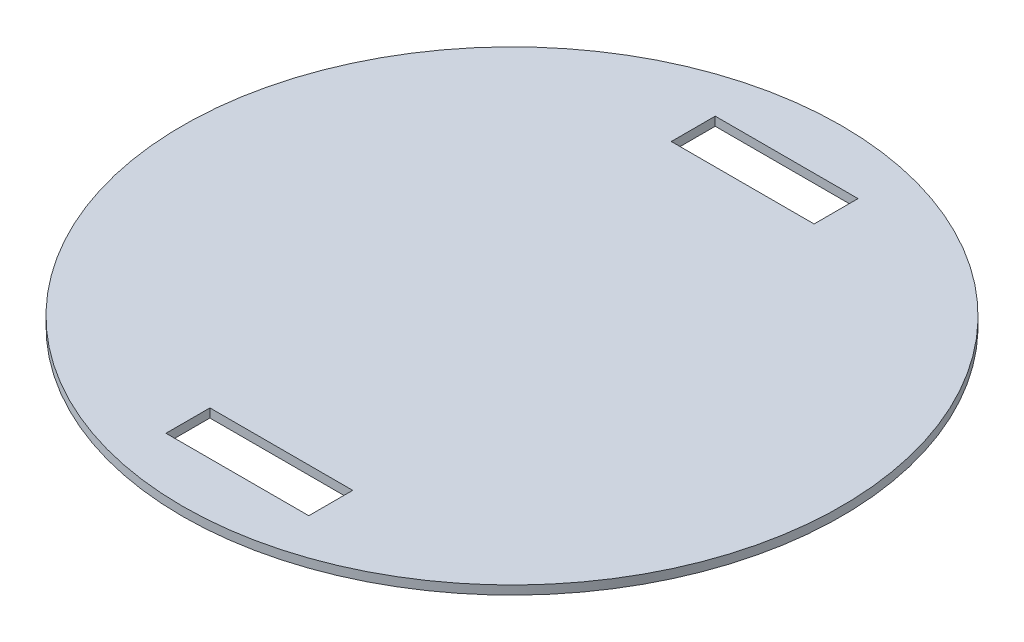
ISO-10303-21;
HEADER;
FILE_DESCRIPTION(('STEP AP214'),'2;1');
FILE_NAME('part.step','',(''),(''),'','','');
FILE_SCHEMA(('AUTOMOTIVE_DESIGN { 1 0 10303 214 1 1 1 1 }'));
ENDSEC;
DATA;
#1=APPLICATION_CONTEXT('core data for automotive mechanical design processes');
#2=APPLICATION_PROTOCOL_DEFINITION('international standard','automotive_design',2000,#1);
#3=PRODUCT_CONTEXT('',#1,'mechanical');
#4=PRODUCT('Part','Part','',(#3));
#5=PRODUCT_RELATED_PRODUCT_CATEGORY('part','',(#4));
#6=PRODUCT_DEFINITION_FORMATION('','',#4);
#7=PRODUCT_DEFINITION_CONTEXT('part definition',#1,'design');
#8=PRODUCT_DEFINITION('design','',#6,#7);
#9=PRODUCT_DEFINITION_SHAPE('','',#8);
#10=(LENGTH_UNIT() NAMED_UNIT(*) SI_UNIT(.MILLI.,.METRE.));
#11=(NAMED_UNIT(*) PLANE_ANGLE_UNIT() SI_UNIT($,.RADIAN.));
#12=(NAMED_UNIT(*) SI_UNIT($,.STERADIAN.) SOLID_ANGLE_UNIT());
#13=UNCERTAINTY_MEASURE_WITH_UNIT(LENGTH_MEASURE(1.E-05),#10,'distance_accuracy_value','');
#14=(GEOMETRIC_REPRESENTATION_CONTEXT(3) GLOBAL_UNCERTAINTY_ASSIGNED_CONTEXT((#13)) GLOBAL_UNIT_ASSIGNED_CONTEXT((#10,
#11,#12)) REPRESENTATION_CONTEXT('',''));
#15=CARTESIAN_POINT('',(0.,0.,0.));
#16=DIRECTION('',(0.,0.,1.));
#17=DIRECTION('',(1.,0.,0.));
#18=AXIS2_PLACEMENT_3D('',#15,#16,#17);
#19=CARTESIAN_POINT('',(0.,-4.,0.));
#20=DIRECTION('',(0.,1.,0.));
#21=DIRECTION('',(0.,0.,1.));
#22=AXIS2_PLACEMENT_3D('',#19,#20,#21);
#23=CYLINDRICAL_SURFACE('',#22,150.);
#24=CARTESIAN_POINT('',(0.,-4.,0.));
#25=DIRECTION('',(0.,1.,0.));
#26=DIRECTION('',(0.,0.,1.));
#27=AXIS2_PLACEMENT_3D('',#24,#25,#26);
#28=CIRCLE('',#27,150.);
#29=CARTESIAN_POINT('',(0.,-4.,150.));
#30=VERTEX_POINT('',#29);
#31=EDGE_CURVE('E11',#30,#30,#28,.T.);
#32=ORIENTED_EDGE('',*,*,#31,.T.);
#33=EDGE_LOOP('',(#32));
#34=FACE_BOUND('',#33,.T.);
#35=CARTESIAN_POINT('',(0.,0.,0.));
#36=DIRECTION('',(0.,1.,0.));
#37=DIRECTION('',(0.,0.,1.));
#38=AXIS2_PLACEMENT_3D('',#35,#36,#37);
#39=CIRCLE('',#38,150.);
#40=CARTESIAN_POINT('',(0.,0.,150.));
#41=VERTEX_POINT('',#40);
#42=EDGE_CURVE('E37',#41,#41,#39,.T.);
#43=ORIENTED_EDGE('',*,*,#42,.F.);
#44=EDGE_LOOP('',(#43));
#45=FACE_BOUND('',#44,.T.);
#46=ADVANCED_FACE('F34',(#34,#45),#23,.T.);
#47=CARTESIAN_POINT('',(0.,-4.,0.));
#48=DIRECTION('',(0.,1.,0.));
#49=DIRECTION('',(0.,0.,1.));
#50=AXIS2_PLACEMENT_3D('',#47,#48,#49);
#51=PLANE('',#50);
#52=DIRECTION('',(-1.,0.,0.));
#53=VECTOR('',#52,1.);
#54=CARTESIAN_POINT('',(-32.5,-4.,105.));
#55=LINE('',#54,#53);
#56=CARTESIAN_POINT('',(32.5,-4.,105.));
#57=VERTEX_POINT('',#56);
#58=CARTESIAN_POINT('',(-32.5,-4.,105.));
#59=VERTEX_POINT('',#58);
#60=EDGE_CURVE('E110',#57,#59,#55,.T.);
#61=ORIENTED_EDGE('',*,*,#60,.T.);
#62=DIRECTION('',(0.,0.,1.));
#63=VECTOR('',#62,1.);
#64=CARTESIAN_POINT('',(-32.5,-4.,125.));
#65=LINE('',#64,#63);
#66=CARTESIAN_POINT('',(-32.5,-4.,125.));
#67=VERTEX_POINT('',#66);
#68=EDGE_CURVE('E102',#59,#67,#65,.T.);
#69=ORIENTED_EDGE('',*,*,#68,.T.);
#70=DIRECTION('',(1.,0.,0.));
#71=VECTOR('',#70,1.);
#72=CARTESIAN_POINT('',(-32.5,-4.,125.));
#73=LINE('',#72,#71);
#74=CARTESIAN_POINT('',(32.5,-4.,125.));
#75=VERTEX_POINT('',#74);
#76=EDGE_CURVE('E113',#67,#75,#73,.T.);
#77=ORIENTED_EDGE('',*,*,#76,.T.);
#78=DIRECTION('',(0.,0.,-1.));
#79=VECTOR('',#78,1.);
#80=CARTESIAN_POINT('',(32.5,-4.,125.));
#81=LINE('',#80,#79);
#82=EDGE_CURVE('E48',#75,#57,#81,.T.);
#83=ORIENTED_EDGE('',*,*,#82,.T.);
#84=EDGE_LOOP('',(#61,#69,#77,#83));
#85=FACE_BOUND('',#84,.T.);
#86=DIRECTION('',(-1.,0.,0.));
#87=VECTOR('',#86,1.);
#88=CARTESIAN_POINT('',(-32.5,-4.,-125.));
#89=LINE('',#88,#87);
#90=CARTESIAN_POINT('',(32.5,-4.,-125.));
#91=VERTEX_POINT('',#90);
#92=CARTESIAN_POINT('',(-32.5,-4.,-125.));
#93=VERTEX_POINT('',#92);
#94=EDGE_CURVE('E147',#91,#93,#89,.T.);
#95=ORIENTED_EDGE('',*,*,#94,.T.);
#96=DIRECTION('',(0.,0.,1.));
#97=VECTOR('',#96,1.);
#98=CARTESIAN_POINT('',(-32.5,-4.,-105.));
#99=LINE('',#98,#97);
#100=CARTESIAN_POINT('',(-32.5,-4.,-105.));
#101=VERTEX_POINT('',#100);
#102=EDGE_CURVE('E139',#93,#101,#99,.T.);
#103=ORIENTED_EDGE('',*,*,#102,.T.);
#104=DIRECTION('',(1.,0.,0.));
#105=VECTOR('',#104,1.);
#106=CARTESIAN_POINT('',(-32.5,-4.,-105.));
#107=LINE('',#106,#105);
#108=CARTESIAN_POINT('',(32.5,-4.,-105.));
#109=VERTEX_POINT('',#108);
#110=EDGE_CURVE('E142',#101,#109,#107,.T.);
#111=ORIENTED_EDGE('',*,*,#110,.T.);
#112=DIRECTION('',(0.,0.,-1.));
#113=VECTOR('',#112,1.);
#114=CARTESIAN_POINT('',(32.5,-4.,-105.));
#115=LINE('',#114,#113);
#116=EDGE_CURVE('E56',#109,#91,#115,.T.);
#117=ORIENTED_EDGE('',*,*,#116,.T.);
#118=EDGE_LOOP('',(#95,#103,#111,#117));
#119=FACE_BOUND('',#118,.T.);
#120=ORIENTED_EDGE('',*,*,#31,.F.);
#121=EDGE_LOOP('',(#120));
#122=FACE_BOUND('',#121,.T.);
#123=ADVANCED_FACE('F117',(#85,#119,#122),#51,.F.);
#124=CARTESIAN_POINT('',(0.,0.,0.));
#125=DIRECTION('',(0.,1.,0.));
#126=DIRECTION('',(0.,0.,1.));
#127=AXIS2_PLACEMENT_3D('',#124,#125,#126);
#128=PLANE('',#127);
#129=DIRECTION('',(0.,0.,1.));
#130=VECTOR('',#129,1.);
#131=CARTESIAN_POINT('',(-32.5,0.,125.));
#132=LINE('',#131,#130);
#133=CARTESIAN_POINT('',(-32.5,0.,105.));
#134=VERTEX_POINT('',#133);
#135=CARTESIAN_POINT('',(-32.5,0.,125.));
#136=VERTEX_POINT('',#135);
#137=EDGE_CURVE('E105',#134,#136,#132,.T.);
#138=ORIENTED_EDGE('',*,*,#137,.F.);
#139=DIRECTION('',(-1.,0.,0.));
#140=VECTOR('',#139,1.);
#141=CARTESIAN_POINT('',(-32.5,0.,105.));
#142=LINE('',#141,#140);
#143=CARTESIAN_POINT('',(32.5,0.,105.));
#144=VERTEX_POINT('',#143);
#145=EDGE_CURVE('E120',#144,#134,#142,.T.);
#146=ORIENTED_EDGE('',*,*,#145,.F.);
#147=DIRECTION('',(0.,0.,-1.));
#148=VECTOR('',#147,1.);
#149=CARTESIAN_POINT('',(32.5,0.,125.));
#150=LINE('',#149,#148);
#151=CARTESIAN_POINT('',(32.5,0.,125.));
#152=VERTEX_POINT('',#151);
#153=EDGE_CURVE('E123',#152,#144,#150,.T.);
#154=ORIENTED_EDGE('',*,*,#153,.F.);
#155=DIRECTION('',(1.,0.,0.));
#156=VECTOR('',#155,1.);
#157=CARTESIAN_POINT('',(-32.5,0.,125.));
#158=LINE('',#157,#156);
#159=EDGE_CURVE('E129',#136,#152,#158,.T.);
#160=ORIENTED_EDGE('',*,*,#159,.F.);
#161=EDGE_LOOP('',(#138,#146,#154,#160));
#162=FACE_BOUND('',#161,.T.);
#163=DIRECTION('',(0.,0.,1.));
#164=VECTOR('',#163,1.);
#165=CARTESIAN_POINT('',(-32.5,0.,-105.));
#166=LINE('',#165,#164);
#167=CARTESIAN_POINT('',(-32.5,0.,-125.));
#168=VERTEX_POINT('',#167);
#169=CARTESIAN_POINT('',(-32.5,0.,-105.));
#170=VERTEX_POINT('',#169);
#171=EDGE_CURVE('E151',#168,#170,#166,.T.);
#172=ORIENTED_EDGE('',*,*,#171,.F.);
#173=DIRECTION('',(-1.,0.,0.));
#174=VECTOR('',#173,1.);
#175=CARTESIAN_POINT('',(-32.5,0.,-125.));
#176=LINE('',#175,#174);
#177=CARTESIAN_POINT('',(32.5,0.,-125.));
#178=VERTEX_POINT('',#177);
#179=EDGE_CURVE('E143',#178,#168,#176,.T.);
#180=ORIENTED_EDGE('',*,*,#179,.F.);
#181=DIRECTION('',(0.,0.,-1.));
#182=VECTOR('',#181,1.);
#183=CARTESIAN_POINT('',(32.5,0.,-105.));
#184=LINE('',#183,#182);
#185=CARTESIAN_POINT('',(32.5,0.,-105.));
#186=VERTEX_POINT('',#185);
#187=EDGE_CURVE('E156',#186,#178,#184,.T.);
#188=ORIENTED_EDGE('',*,*,#187,.F.);
#189=DIRECTION('',(1.,0.,0.));
#190=VECTOR('',#189,1.);
#191=CARTESIAN_POINT('',(-32.5,0.,-105.));
#192=LINE('',#191,#190);
#193=EDGE_CURVE('E153',#170,#186,#192,.T.);
#194=ORIENTED_EDGE('',*,*,#193,.F.);
#195=EDGE_LOOP('',(#172,#180,#188,#194));
#196=FACE_BOUND('',#195,.T.);
#197=ORIENTED_EDGE('',*,*,#42,.T.);
#198=EDGE_LOOP('',(#197));
#199=FACE_BOUND('',#198,.T.);
#200=ADVANCED_FACE('F176',(#162,#196,#199),#128,.T.);
#201=CARTESIAN_POINT('',(-32.5,-4.,-105.));
#202=DIRECTION('',(-1.,0.,0.));
#203=DIRECTION('',(0.,0.,1.));
#204=AXIS2_PLACEMENT_3D('',#201,#202,#203);
#205=PLANE('',#204);
#206=ORIENTED_EDGE('',*,*,#171,.T.);
#207=DIRECTION('',(0.,1.,0.));
#208=VECTOR('',#207,1.);
#209=CARTESIAN_POINT('',(-32.5,-4.,-105.));
#210=LINE('',#209,#208);
#211=EDGE_CURVE('E150',#101,#170,#210,.T.);
#212=ORIENTED_EDGE('',*,*,#211,.F.);
#213=ORIENTED_EDGE('',*,*,#102,.F.);
#214=DIRECTION('',(0.,1.,0.));
#215=VECTOR('',#214,1.);
#216=CARTESIAN_POINT('',(-32.5,-4.,-125.));
#217=LINE('',#216,#215);
#218=EDGE_CURVE('E130',#93,#168,#217,.T.);
#219=ORIENTED_EDGE('',*,*,#218,.T.);
#220=EDGE_LOOP('',(#206,#212,#213,#219));
#221=FACE_BOUND('',#220,.T.);
#222=ADVANCED_FACE('F182',(#221),#205,.F.);
#223=CARTESIAN_POINT('',(-32.5,-4.,-125.));
#224=DIRECTION('',(0.,0.,-1.));
#225=DIRECTION('',(-1.,0.,0.));
#226=AXIS2_PLACEMENT_3D('',#223,#224,#225);
#227=PLANE('',#226);
#228=ORIENTED_EDGE('',*,*,#179,.T.);
#229=ORIENTED_EDGE('',*,*,#218,.F.);
#230=ORIENTED_EDGE('',*,*,#94,.F.);
#231=DIRECTION('',(0.,1.,0.));
#232=VECTOR('',#231,1.);
#233=CARTESIAN_POINT('',(32.5,-4.,-125.));
#234=LINE('',#233,#232);
#235=EDGE_CURVE('E162',#91,#178,#234,.T.);
#236=ORIENTED_EDGE('',*,*,#235,.T.);
#237=EDGE_LOOP('',(#228,#229,#230,#236));
#238=FACE_BOUND('',#237,.T.);
#239=ADVANCED_FACE('F184',(#238),#227,.F.);
#240=CARTESIAN_POINT('',(32.5,-4.,-105.));
#241=DIRECTION('',(1.,0.,0.));
#242=DIRECTION('',(0.,0.,-1.));
#243=AXIS2_PLACEMENT_3D('',#240,#241,#242);
#244=PLANE('',#243);
#245=ORIENTED_EDGE('',*,*,#187,.T.);
#246=ORIENTED_EDGE('',*,*,#235,.F.);
#247=ORIENTED_EDGE('',*,*,#116,.F.);
#248=DIRECTION('',(0.,1.,0.));
#249=VECTOR('',#248,1.);
#250=CARTESIAN_POINT('',(32.5,-4.,-105.));
#251=LINE('',#250,#249);
#252=EDGE_CURVE('E164',#109,#186,#251,.T.);
#253=ORIENTED_EDGE('',*,*,#252,.T.);
#254=EDGE_LOOP('',(#245,#246,#247,#253));
#255=FACE_BOUND('',#254,.T.);
#256=ADVANCED_FACE('F179',(#255),#244,.F.);
#257=CARTESIAN_POINT('',(-32.5,-4.,-105.));
#258=DIRECTION('',(0.,0.,1.));
#259=DIRECTION('',(1.,0.,0.));
#260=AXIS2_PLACEMENT_3D('',#257,#258,#259);
#261=PLANE('',#260);
#262=ORIENTED_EDGE('',*,*,#193,.T.);
#263=ORIENTED_EDGE('',*,*,#252,.F.);
#264=ORIENTED_EDGE('',*,*,#110,.F.);
#265=ORIENTED_EDGE('',*,*,#211,.T.);
#266=EDGE_LOOP('',(#262,#263,#264,#265));
#267=FACE_BOUND('',#266,.T.);
#268=ADVANCED_FACE('F170',(#267),#261,.F.);
#269=CARTESIAN_POINT('',(-32.5,-4.,125.));
#270=DIRECTION('',(-1.,0.,0.));
#271=DIRECTION('',(0.,0.,1.));
#272=AXIS2_PLACEMENT_3D('',#269,#270,#271);
#273=PLANE('',#272);
#274=ORIENTED_EDGE('',*,*,#137,.T.);
#275=DIRECTION('',(0.,1.,0.));
#276=VECTOR('',#275,1.);
#277=CARTESIAN_POINT('',(-32.5,-4.,125.));
#278=LINE('',#277,#276);
#279=EDGE_CURVE('E98',#67,#136,#278,.T.);
#280=ORIENTED_EDGE('',*,*,#279,.F.);
#281=ORIENTED_EDGE('',*,*,#68,.F.);
#282=DIRECTION('',(0.,1.,0.));
#283=VECTOR('',#282,1.);
#284=CARTESIAN_POINT('',(-32.5,-4.,105.));
#285=LINE('',#284,#283);
#286=EDGE_CURVE('E134',#59,#134,#285,.T.);
#287=ORIENTED_EDGE('',*,*,#286,.T.);
#288=EDGE_LOOP('',(#274,#280,#281,#287));
#289=FACE_BOUND('',#288,.T.);
#290=ADVANCED_FACE('F100',(#289),#273,.F.);
#291=CARTESIAN_POINT('',(-32.5,-4.,105.));
#292=DIRECTION('',(0.,0.,-1.));
#293=DIRECTION('',(-1.,0.,0.));
#294=AXIS2_PLACEMENT_3D('',#291,#292,#293);
#295=PLANE('',#294);
#296=ORIENTED_EDGE('',*,*,#145,.T.);
#297=ORIENTED_EDGE('',*,*,#286,.F.);
#298=ORIENTED_EDGE('',*,*,#60,.F.);
#299=DIRECTION('',(0.,1.,0.));
#300=VECTOR('',#299,1.);
#301=CARTESIAN_POINT('',(32.5,-4.,105.));
#302=LINE('',#301,#300);
#303=EDGE_CURVE('E136',#57,#144,#302,.T.);
#304=ORIENTED_EDGE('',*,*,#303,.T.);
#305=EDGE_LOOP('',(#296,#297,#298,#304));
#306=FACE_BOUND('',#305,.T.);
#307=ADVANCED_FACE('F213',(#306),#295,.F.);
#308=CARTESIAN_POINT('',(32.5,-4.,125.));
#309=DIRECTION('',(1.,0.,0.));
#310=DIRECTION('',(0.,0.,-1.));
#311=AXIS2_PLACEMENT_3D('',#308,#309,#310);
#312=PLANE('',#311);
#313=ORIENTED_EDGE('',*,*,#153,.T.);
#314=ORIENTED_EDGE('',*,*,#303,.F.);
#315=ORIENTED_EDGE('',*,*,#82,.F.);
#316=DIRECTION('',(0.,1.,0.));
#317=VECTOR('',#316,1.);
#318=CARTESIAN_POINT('',(32.5,-4.,125.));
#319=LINE('',#318,#317);
#320=EDGE_CURVE('E109',#75,#152,#319,.T.);
#321=ORIENTED_EDGE('',*,*,#320,.T.);
#322=EDGE_LOOP('',(#313,#314,#315,#321));
#323=FACE_BOUND('',#322,.T.);
#324=ADVANCED_FACE('F217',(#323),#312,.F.);
#325=CARTESIAN_POINT('',(-32.5,-4.,125.));
#326=DIRECTION('',(0.,0.,1.));
#327=DIRECTION('',(1.,0.,0.));
#328=AXIS2_PLACEMENT_3D('',#325,#326,#327);
#329=PLANE('',#328);
#330=ORIENTED_EDGE('',*,*,#159,.T.);
#331=ORIENTED_EDGE('',*,*,#320,.F.);
#332=ORIENTED_EDGE('',*,*,#76,.F.);
#333=ORIENTED_EDGE('',*,*,#279,.T.);
#334=EDGE_LOOP('',(#330,#331,#332,#333));
#335=FACE_BOUND('',#334,.T.);
#336=ADVANCED_FACE('F114',(#335),#329,.F.);
#337=CLOSED_SHELL('',(#46,#123,#200,#222,#239,#256,#268,#290,#307,#324,#336));
#338=MANIFOLD_SOLID_BREP('B2',#337);
#339=ADVANCED_BREP_SHAPE_REPRESENTATION('',(#18,#338),#14);
#340=SHAPE_DEFINITION_REPRESENTATION(#9,#339);
ENDSEC;
END-ISO-10303-21;
